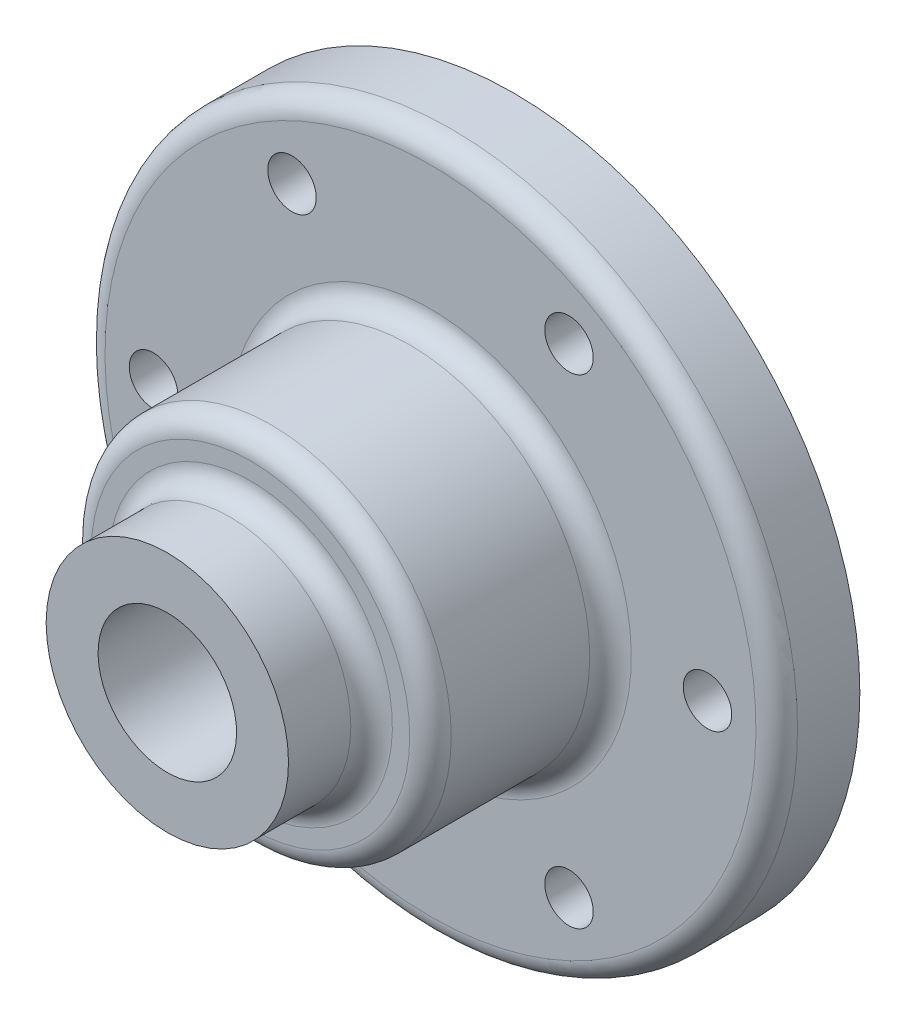
ISO-10303-21;
HEADER;
FILE_DESCRIPTION(('STEP AP214'),'2;1');
FILE_NAME('part.step','',(''),(''),'','','');
FILE_SCHEMA(('AUTOMOTIVE_DESIGN { 1 0 10303 214 1 1 1 1 }'));
ENDSEC;
DATA;
#1=APPLICATION_CONTEXT('core data for automotive mechanical design processes');
#2=APPLICATION_PROTOCOL_DEFINITION('international standard','automotive_design',2000,#1);
#3=PRODUCT_CONTEXT('',#1,'mechanical');
#4=PRODUCT('Part','Part','',(#3));
#5=PRODUCT_RELATED_PRODUCT_CATEGORY('part','',(#4));
#6=PRODUCT_DEFINITION_FORMATION('','',#4);
#7=PRODUCT_DEFINITION_CONTEXT('part definition',#1,'design');
#8=PRODUCT_DEFINITION('design','',#6,#7);
#9=PRODUCT_DEFINITION_SHAPE('','',#8);
#10=(LENGTH_UNIT() NAMED_UNIT(*) SI_UNIT(.MILLI.,.METRE.));
#11=(NAMED_UNIT(*) PLANE_ANGLE_UNIT() SI_UNIT($,.RADIAN.));
#12=(NAMED_UNIT(*) SI_UNIT($,.STERADIAN.) SOLID_ANGLE_UNIT());
#13=UNCERTAINTY_MEASURE_WITH_UNIT(LENGTH_MEASURE(1.E-05),#10,'distance_accuracy_value','');
#14=(GEOMETRIC_REPRESENTATION_CONTEXT(3) GLOBAL_UNCERTAINTY_ASSIGNED_CONTEXT((#13)) GLOBAL_UNIT_ASSIGNED_CONTEXT((#10,
#11,#12)) REPRESENTATION_CONTEXT('',''));
#15=CARTESIAN_POINT('',(0.,0.,0.));
#16=DIRECTION('',(0.,0.,1.));
#17=DIRECTION('',(1.,0.,0.));
#18=AXIS2_PLACEMENT_3D('',#15,#16,#17);
#19=CARTESIAN_POINT('',(0.,50.,0.));
#20=DIRECTION('',(0.,0.,-1.));
#21=DIRECTION('',(0.,1.,0.));
#22=AXIS2_PLACEMENT_3D('',#19,#20,#21);
#23=PLANE('',#22);
#24=CARTESIAN_POINT('',(0.,0.,0.));
#25=DIRECTION('',(0.,0.,-1.));
#26=DIRECTION('',(-1.,0.,0.));
#27=AXIS2_PLACEMENT_3D('',#24,#25,#26);
#28=CIRCLE('',#27,27.25);
#29=CARTESIAN_POINT('',(-27.25,0.,0.));
#30=VERTEX_POINT('',#29);
#31=EDGE_CURVE('E129',#30,#30,#28,.T.);
#32=ORIENTED_EDGE('',*,*,#31,.T.);
#33=EDGE_LOOP('',(#32));
#34=FACE_BOUND('',#33,.T.);
#35=CARTESIAN_POINT('',(0.,0.,0.));
#36=DIRECTION('',(0.,0.,-1.));
#37=DIRECTION('',(0.,1.,0.));
#38=AXIS2_PLACEMENT_3D('',#35,#36,#37);
#39=CIRCLE('',#38,20.);
#40=CARTESIAN_POINT('',(0.,20.,0.));
#41=VERTEX_POINT('',#40);
#42=EDGE_CURVE('E84',#41,#41,#39,.T.);
#43=ORIENTED_EDGE('',*,*,#42,.F.);
#44=EDGE_LOOP('',(#43));
#45=FACE_BOUND('',#44,.T.);
#46=ADVANCED_FACE('F40',(#34,#45),#23,.T.);
#47=CARTESIAN_POINT('',(0.,0.,0.));
#48=DIRECTION('',(0.,0.,-1.));
#49=DIRECTION('',(0.,1.,0.));
#50=AXIS2_PLACEMENT_3D('',#47,#48,#49);
#51=CYLINDRICAL_SURFACE('',#50,17.5);
#52=CARTESIAN_POINT('',(0.,0.,41.));
#53=DIRECTION('',(0.,0.,1.));
#54=DIRECTION('',(0.,-1.,0.));
#55=AXIS2_PLACEMENT_3D('',#52,#53,#54);
#56=CIRCLE('',#55,17.5);
#57=CARTESIAN_POINT('',(0.,-17.5,41.));
#58=VERTEX_POINT('',#57);
#59=EDGE_CURVE('E63',#58,#58,#56,.T.);
#60=ORIENTED_EDGE('',*,*,#59,.T.);
#61=EDGE_LOOP('',(#60));
#62=FACE_BOUND('',#61,.T.);
#63=CARTESIAN_POINT('',(0.,0.,50.));
#64=DIRECTION('',(0.,0.,-1.));
#65=DIRECTION('',(0.,1.,0.));
#66=AXIS2_PLACEMENT_3D('',#63,#64,#65);
#67=CIRCLE('',#66,17.5);
#68=CARTESIAN_POINT('',(0.,17.5,50.));
#69=VERTEX_POINT('',#68);
#70=EDGE_CURVE('E72',#69,#69,#67,.T.);
#71=ORIENTED_EDGE('',*,*,#70,.T.);
#72=EDGE_LOOP('',(#71));
#73=FACE_BOUND('',#72,.T.);
#74=ADVANCED_FACE('F160',(#62,#73),#51,.T.);
#75=CARTESIAN_POINT('',(0.,17.5,50.));
#76=DIRECTION('',(0.,0.,1.));
#77=DIRECTION('',(0.,-1.,0.));
#78=AXIS2_PLACEMENT_3D('',#75,#76,#77);
#79=PLANE('',#78);
#80=CARTESIAN_POINT('',(0.,0.,50.));
#81=DIRECTION('',(0.,0.,-1.));
#82=DIRECTION('',(0.,1.,0.));
#83=AXIS2_PLACEMENT_3D('',#80,#81,#82);
#84=CIRCLE('',#83,10.);
#85=CARTESIAN_POINT('',(0.,9.99999999999999,50.));
#86=VERTEX_POINT('',#85);
#87=EDGE_CURVE('E75',#86,#86,#84,.T.);
#88=ORIENTED_EDGE('',*,*,#87,.T.);
#89=EDGE_LOOP('',(#88));
#90=FACE_BOUND('',#89,.T.);
#91=ORIENTED_EDGE('',*,*,#70,.F.);
#92=EDGE_LOOP('',(#91));
#93=FACE_BOUND('',#92,.T.);
#94=ADVANCED_FACE('F167',(#90,#93),#79,.T.);
#95=CARTESIAN_POINT('',(0.,0.,0.));
#96=DIRECTION('',(0.,0.,-1.));
#97=DIRECTION('',(0.,1.,0.));
#98=AXIS2_PLACEMENT_3D('',#95,#96,#97);
#99=CYLINDRICAL_SURFACE('',#98,10.);
#100=CARTESIAN_POINT('',(0.,0.,9.99999999999999));
#101=DIRECTION('',(0.,0.,-1.));
#102=DIRECTION('',(0.,1.,0.));
#103=AXIS2_PLACEMENT_3D('',#100,#101,#102);
#104=CIRCLE('',#103,10.);
#105=CARTESIAN_POINT('',(0.,10.,9.99999999999999));
#106=VERTEX_POINT('',#105);
#107=EDGE_CURVE('E78',#106,#106,#104,.T.);
#108=ORIENTED_EDGE('',*,*,#107,.T.);
#109=EDGE_LOOP('',(#108));
#110=FACE_BOUND('',#109,.T.);
#111=ORIENTED_EDGE('',*,*,#87,.F.);
#112=EDGE_LOOP('',(#111));
#113=FACE_BOUND('',#112,.T.);
#114=ADVANCED_FACE('F285',(#110,#113),#99,.F.);
#115=CARTESIAN_POINT('',(0.,20.,9.99999999999999));
#116=DIRECTION('',(0.,0.,-1.));
#117=DIRECTION('',(0.,1.,0.));
#118=AXIS2_PLACEMENT_3D('',#115,#116,#117);
#119=PLANE('',#118);
#120=CARTESIAN_POINT('',(0.,0.,9.99999999999999));
#121=DIRECTION('',(0.,0.,-1.));
#122=DIRECTION('',(0.,1.,0.));
#123=AXIS2_PLACEMENT_3D('',#120,#121,#122);
#124=CIRCLE('',#123,20.);
#125=CARTESIAN_POINT('',(0.,20.,10.));
#126=VERTEX_POINT('',#125);
#127=EDGE_CURVE('E81',#126,#126,#124,.T.);
#128=ORIENTED_EDGE('',*,*,#127,.T.);
#129=EDGE_LOOP('',(#128));
#130=FACE_BOUND('',#129,.T.);
#131=ORIENTED_EDGE('',*,*,#107,.F.);
#132=EDGE_LOOP('',(#131));
#133=FACE_BOUND('',#132,.T.);
#134=ADVANCED_FACE('F182',(#130,#133),#119,.T.);
#135=CARTESIAN_POINT('',(0.,0.,0.));
#136=DIRECTION('',(0.,0.,-1.));
#137=DIRECTION('',(0.,1.,0.));
#138=AXIS2_PLACEMENT_3D('',#135,#136,#137);
#139=CYLINDRICAL_SURFACE('',#138,20.);
#140=ORIENTED_EDGE('',*,*,#42,.T.);
#141=EDGE_LOOP('',(#140));
#142=FACE_BOUND('',#141,.T.);
#143=ORIENTED_EDGE('',*,*,#127,.F.);
#144=EDGE_LOOP('',(#143));
#145=FACE_BOUND('',#144,.T.);
#146=ADVANCED_FACE('F175',(#142,#145),#139,.F.);
#147=CARTESIAN_POINT('',(0.,0.,0.));
#148=DIRECTION('',(0.,0.,-1.));
#149=DIRECTION('',(-1.,0.,0.));
#150=AXIS2_PLACEMENT_3D('',#147,#148,#149);
#151=CIRCLE('',#150,30.8);
#152=CARTESIAN_POINT('',(-30.8,0.,0.));
#153=VERTEX_POINT('',#152);
#154=EDGE_CURVE('E132',#153,#153,#151,.T.);
#155=ORIENTED_EDGE('',*,*,#154,.F.);
#156=EDGE_LOOP('',(#155));
#157=FACE_BOUND('',#156,.T.);
#158=CARTESIAN_POINT('',(20.0000000000004,34.6410161513773,0.));
#159=DIRECTION('',(0.,0.,1.));
#160=DIRECTION('',(0.50000000000001,0.866025403784433,0.));
#161=AXIS2_PLACEMENT_3D('',#158,#159,#160);
#162=CIRCLE('',#161,3.5);
#163=CARTESIAN_POINT('',(21.7500000000004,37.6721050646228,0.));
#164=VERTEX_POINT('',#163);
#165=EDGE_CURVE('E107',#164,#164,#162,.T.);
#166=ORIENTED_EDGE('',*,*,#165,.T.);
#167=EDGE_LOOP('',(#166));
#168=FACE_BOUND('',#167,.T.);
#169=CARTESIAN_POINT('',(-19.9999999999997,34.6410161513777,0.));
#170=DIRECTION('',(0.,0.,1.));
#171=DIRECTION('',(-0.499999999999992,0.866025403784443,0.));
#172=AXIS2_PLACEMENT_3D('',#169,#170,#171);
#173=CIRCLE('',#172,3.5);
#174=CARTESIAN_POINT('',(-21.7499999999996,37.6721050646233,0.));
#175=VERTEX_POINT('',#174);
#176=EDGE_CURVE('E106',#175,#175,#173,.T.);
#177=ORIENTED_EDGE('',*,*,#176,.T.);
#178=EDGE_LOOP('',(#177));
#179=FACE_BOUND('',#178,.T.);
#180=CARTESIAN_POINT('',(-40.,0.,0.));
#181=DIRECTION('',(0.,0.,1.));
#182=DIRECTION('',(-1.,0.,0.));
#183=AXIS2_PLACEMENT_3D('',#180,#181,#182);
#184=CIRCLE('',#183,3.5);
#185=CARTESIAN_POINT('',(-43.5,0.,0.));
#186=VERTEX_POINT('',#185);
#187=EDGE_CURVE('E114',#186,#186,#184,.T.);
#188=ORIENTED_EDGE('',*,*,#187,.T.);
#189=EDGE_LOOP('',(#188));
#190=FACE_BOUND('',#189,.T.);
#191=CARTESIAN_POINT('',(-20.0000000000002,-34.6410161513775,0.));
#192=DIRECTION('',(0.,0.,1.));
#193=DIRECTION('',(-0.500000000000004,-0.866025403784436,0.));
#194=AXIS2_PLACEMENT_3D('',#191,#192,#193);
#195=CIRCLE('',#194,3.5);
#196=CARTESIAN_POINT('',(-21.7500000000002,-37.672105064623,0.));
#197=VERTEX_POINT('',#196);
#198=EDGE_CURVE('E120',#197,#197,#195,.T.);
#199=ORIENTED_EDGE('',*,*,#198,.T.);
#200=EDGE_LOOP('',(#199));
#201=FACE_BOUND('',#200,.T.);
#202=CARTESIAN_POINT('',(19.9999999999999,-34.6410161513776,0.));
#203=DIRECTION('',(0.,0.,1.));
#204=DIRECTION('',(0.499999999999998,-0.86602540378444,0.));
#205=AXIS2_PLACEMENT_3D('',#202,#203,#204);
#206=CIRCLE('',#205,3.5);
#207=CARTESIAN_POINT('',(21.7499999999999,-37.6721050646231,0.));
#208=VERTEX_POINT('',#207);
#209=EDGE_CURVE('E99',#208,#208,#206,.T.);
#210=ORIENTED_EDGE('',*,*,#209,.T.);
#211=EDGE_LOOP('',(#210));
#212=FACE_BOUND('',#211,.T.);
#213=CARTESIAN_POINT('',(40.,0.,0.));
#214=DIRECTION('',(0.,0.,1.));
#215=DIRECTION('',(1.,0.,0.));
#216=AXIS2_PLACEMENT_3D('',#213,#214,#215);
#217=CIRCLE('',#216,3.5);
#218=CARTESIAN_POINT('',(43.5,0.,0.));
#219=VERTEX_POINT('',#218);
#220=EDGE_CURVE('E90',#219,#219,#217,.T.);
#221=ORIENTED_EDGE('',*,*,#220,.T.);
#222=EDGE_LOOP('',(#221));
#223=FACE_BOUND('',#222,.T.);
#224=CARTESIAN_POINT('',(0.,0.,0.));
#225=DIRECTION('',(0.,0.,-1.));
#226=DIRECTION('',(0.,1.,0.));
#227=AXIS2_PLACEMENT_3D('',#224,#225,#226);
#228=CIRCLE('',#227,50.);
#229=CARTESIAN_POINT('',(0.,50.,0.));
#230=VERTEX_POINT('',#229);
#231=EDGE_CURVE('E87',#230,#230,#228,.T.);
#232=ORIENTED_EDGE('',*,*,#231,.T.);
#233=EDGE_LOOP('',(#232));
#234=FACE_BOUND('',#233,.T.);
#235=ADVANCED_FACE('F163',(#157,#168,#179,#190,#201,#212,#223,#234),#23,.T.);
#236=CARTESIAN_POINT('',(0.,0.,0.));
#237=DIRECTION('',(0.,0.,-1.));
#238=DIRECTION('',(0.,1.,0.));
#239=AXIS2_PLACEMENT_3D('',#236,#237,#238);
#240=CYLINDRICAL_SURFACE('',#239,50.);
#241=CARTESIAN_POINT('',(0.,0.,8.99999999999999));
#242=DIRECTION('',(0.,0.,1.));
#243=DIRECTION('',(0.,-1.,0.));
#244=AXIS2_PLACEMENT_3D('',#241,#242,#243);
#245=CIRCLE('',#244,50.);
#246=CARTESIAN_POINT('',(0.,-50.,8.99999999999998));
#247=VERTEX_POINT('',#246);
#248=EDGE_CURVE('E10',#247,#247,#245,.F.);
#249=ORIENTED_EDGE('',*,*,#248,.T.);
#250=EDGE_LOOP('',(#249));
#251=FACE_BOUND('',#250,.T.);
#252=ORIENTED_EDGE('',*,*,#231,.F.);
#253=EDGE_LOOP('',(#252));
#254=FACE_BOUND('',#253,.T.);
#255=ADVANCED_FACE('F174',(#251,#254),#240,.T.);
#256=CARTESIAN_POINT('',(0.,26.,12.));
#257=DIRECTION('',(0.,0.,1.));
#258=DIRECTION('',(0.,-1.,0.));
#259=AXIS2_PLACEMENT_3D('',#256,#257,#258);
#260=PLANE('',#259);
#261=CARTESIAN_POINT('',(0.,0.,12.));
#262=DIRECTION('',(0.,0.,1.));
#263=DIRECTION('',(0.,-1.,0.));
#264=AXIS2_PLACEMENT_3D('',#261,#262,#263);
#265=CIRCLE('',#264,29.);
#266=CARTESIAN_POINT('',(0.,-29.,12.));
#267=VERTEX_POINT('',#266);
#268=EDGE_CURVE('E47',#267,#267,#265,.F.);
#269=ORIENTED_EDGE('',*,*,#268,.T.);
#270=EDGE_LOOP('',(#269));
#271=FACE_BOUND('',#270,.T.);
#272=CARTESIAN_POINT('',(0.,0.,12.));
#273=DIRECTION('',(0.,0.,1.));
#274=DIRECTION('',(0.,-1.,0.));
#275=AXIS2_PLACEMENT_3D('',#272,#273,#274);
#276=CIRCLE('',#275,47.);
#277=CARTESIAN_POINT('',(0.,-47.,12.));
#278=VERTEX_POINT('',#277);
#279=EDGE_CURVE('E51',#278,#278,#276,.T.);
#280=ORIENTED_EDGE('',*,*,#279,.T.);
#281=EDGE_LOOP('',(#280));
#282=FACE_BOUND('',#281,.T.);
#283=CARTESIAN_POINT('',(20.0000000000004,34.6410161513773,12.));
#284=DIRECTION('',(0.,0.,1.));
#285=DIRECTION('',(0.50000000000001,0.866025403784433,0.));
#286=AXIS2_PLACEMENT_3D('',#283,#284,#285);
#287=CIRCLE('',#286,3.5);
#288=CARTESIAN_POINT('',(21.7500000000004,37.6721050646228,12.));
#289=VERTEX_POINT('',#288);
#290=EDGE_CURVE('E103',#289,#289,#287,.T.);
#291=ORIENTED_EDGE('',*,*,#290,.F.);
#292=EDGE_LOOP('',(#291));
#293=FACE_BOUND('',#292,.T.);
#294=CARTESIAN_POINT('',(-19.9999999999997,34.6410161513777,12.));
#295=DIRECTION('',(0.,0.,1.));
#296=DIRECTION('',(-0.499999999999992,0.866025403784443,0.));
#297=AXIS2_PLACEMENT_3D('',#294,#295,#296);
#298=CIRCLE('',#297,3.5);
#299=CARTESIAN_POINT('',(-21.7499999999996,37.6721050646233,12.));
#300=VERTEX_POINT('',#299);
#301=EDGE_CURVE('E111',#300,#300,#298,.T.);
#302=ORIENTED_EDGE('',*,*,#301,.F.);
#303=EDGE_LOOP('',(#302));
#304=FACE_BOUND('',#303,.T.);
#305=CARTESIAN_POINT('',(-40.,0.,12.));
#306=DIRECTION('',(0.,0.,1.));
#307=DIRECTION('',(-1.,0.,0.));
#308=AXIS2_PLACEMENT_3D('',#305,#306,#307);
#309=CIRCLE('',#308,3.5);
#310=CARTESIAN_POINT('',(-43.5,0.,12.));
#311=VERTEX_POINT('',#310);
#312=EDGE_CURVE('E117',#311,#311,#309,.T.);
#313=ORIENTED_EDGE('',*,*,#312,.F.);
#314=EDGE_LOOP('',(#313));
#315=FACE_BOUND('',#314,.T.);
#316=CARTESIAN_POINT('',(-20.0000000000002,-34.6410161513775,12.));
#317=DIRECTION('',(0.,0.,1.));
#318=DIRECTION('',(-0.500000000000004,-0.866025403784436,0.));
#319=AXIS2_PLACEMENT_3D('',#316,#317,#318);
#320=CIRCLE('',#319,3.5);
#321=CARTESIAN_POINT('',(-21.7500000000002,-37.672105064623,12.));
#322=VERTEX_POINT('',#321);
#323=EDGE_CURVE('E102',#322,#322,#320,.T.);
#324=ORIENTED_EDGE('',*,*,#323,.F.);
#325=EDGE_LOOP('',(#324));
#326=FACE_BOUND('',#325,.T.);
#327=CARTESIAN_POINT('',(19.9999999999999,-34.6410161513776,12.));
#328=DIRECTION('',(0.,0.,1.));
#329=DIRECTION('',(0.499999999999998,-0.86602540378444,0.));
#330=AXIS2_PLACEMENT_3D('',#327,#328,#329);
#331=CIRCLE('',#330,3.5);
#332=CARTESIAN_POINT('',(21.7499999999999,-37.6721050646231,12.));
#333=VERTEX_POINT('',#332);
#334=EDGE_CURVE('E96',#333,#333,#331,.T.);
#335=ORIENTED_EDGE('',*,*,#334,.F.);
#336=EDGE_LOOP('',(#335));
#337=FACE_BOUND('',#336,.T.);
#338=CARTESIAN_POINT('',(40.,0.,12.));
#339=DIRECTION('',(0.,0.,1.));
#340=DIRECTION('',(1.,0.,0.));
#341=AXIS2_PLACEMENT_3D('',#338,#339,#340);
#342=CIRCLE('',#341,3.5);
#343=CARTESIAN_POINT('',(43.5,0.,12.));
#344=VERTEX_POINT('',#343);
#345=EDGE_CURVE('E93',#344,#344,#342,.T.);
#346=ORIENTED_EDGE('',*,*,#345,.F.);
#347=EDGE_LOOP('',(#346));
#348=FACE_BOUND('',#347,.T.);
#349=ADVANCED_FACE('F181',(#271,#282,#293,#304,#315,#326,#337,#348),#260,.T.);
#350=CARTESIAN_POINT('',(0.,0.,0.));
#351=DIRECTION('',(0.,0.,-1.));
#352=DIRECTION('',(0.,1.,0.));
#353=AXIS2_PLACEMENT_3D('',#350,#351,#352);
#354=CYLINDRICAL_SURFACE('',#353,26.);
#355=CARTESIAN_POINT('',(0.,0.,35.));
#356=DIRECTION('',(0.,0.,1.));
#357=DIRECTION('',(0.,-1.,0.));
#358=AXIS2_PLACEMENT_3D('',#355,#356,#357);
#359=CIRCLE('',#358,26.);
#360=CARTESIAN_POINT('',(0.,-26.,35.));
#361=VERTEX_POINT('',#360);
#362=EDGE_CURVE('E55',#361,#361,#359,.F.);
#363=ORIENTED_EDGE('',*,*,#362,.T.);
#364=EDGE_LOOP('',(#363));
#365=FACE_BOUND('',#364,.T.);
#366=CARTESIAN_POINT('',(0.,0.,15.));
#367=DIRECTION('',(0.,0.,1.));
#368=DIRECTION('',(0.,-1.,0.));
#369=AXIS2_PLACEMENT_3D('',#366,#367,#368);
#370=CIRCLE('',#369,26.);
#371=CARTESIAN_POINT('',(0.,-26.,15.));
#372=VERTEX_POINT('',#371);
#373=EDGE_CURVE('E60',#372,#372,#370,.T.);
#374=ORIENTED_EDGE('',*,*,#373,.T.);
#375=EDGE_LOOP('',(#374));
#376=FACE_BOUND('',#375,.T.);
#377=ADVANCED_FACE('F210',(#365,#376),#354,.T.);
#378=CARTESIAN_POINT('',(0.,17.5,38.));
#379=DIRECTION('',(0.,0.,1.));
#380=DIRECTION('',(0.,-1.,0.));
#381=AXIS2_PLACEMENT_3D('',#378,#379,#380);
#382=PLANE('',#381);
#383=CARTESIAN_POINT('',(0.,0.,38.));
#384=DIRECTION('',(0.,0.,1.));
#385=DIRECTION('',(0.,-1.,0.));
#386=AXIS2_PLACEMENT_3D('',#383,#384,#385);
#387=CIRCLE('',#386,20.5);
#388=CARTESIAN_POINT('',(0.,-20.5,38.));
#389=VERTEX_POINT('',#388);
#390=EDGE_CURVE('E66',#389,#389,#387,.F.);
#391=ORIENTED_EDGE('',*,*,#390,.T.);
#392=EDGE_LOOP('',(#391));
#393=FACE_BOUND('',#392,.T.);
#394=CARTESIAN_POINT('',(0.,0.,38.));
#395=DIRECTION('',(0.,0.,1.));
#396=DIRECTION('',(0.,-1.,0.));
#397=AXIS2_PLACEMENT_3D('',#394,#395,#396);
#398=CIRCLE('',#397,23.);
#399=CARTESIAN_POINT('',(0.,-23.,38.));
#400=VERTEX_POINT('',#399);
#401=EDGE_CURVE('E69',#400,#400,#398,.T.);
#402=ORIENTED_EDGE('',*,*,#401,.T.);
#403=EDGE_LOOP('',(#402));
#404=FACE_BOUND('',#403,.T.);
#405=ADVANCED_FACE('F205',(#393,#404),#382,.T.);
#406=CARTESIAN_POINT('',(40.,0.,12.));
#407=DIRECTION('',(0.,0.,1.));
#408=DIRECTION('',(1.,0.,0.));
#409=AXIS2_PLACEMENT_3D('',#406,#407,#408);
#410=CYLINDRICAL_SURFACE('',#409,3.5);
#411=ORIENTED_EDGE('',*,*,#220,.F.);
#412=EDGE_LOOP('',(#411));
#413=FACE_BOUND('',#412,.T.);
#414=ORIENTED_EDGE('',*,*,#345,.T.);
#415=EDGE_LOOP('',(#414));
#416=FACE_BOUND('',#415,.T.);
#417=ADVANCED_FACE('F201',(#413,#416),#410,.F.);
#418=CARTESIAN_POINT('',(19.9999999999999,-34.6410161513776,12.));
#419=DIRECTION('',(0.,0.,1.));
#420=DIRECTION('',(0.499999999999998,-0.86602540378444,0.));
#421=AXIS2_PLACEMENT_3D('',#418,#419,#420);
#422=CYLINDRICAL_SURFACE('',#421,3.5);
#423=ORIENTED_EDGE('',*,*,#209,.F.);
#424=EDGE_LOOP('',(#423));
#425=FACE_BOUND('',#424,.T.);
#426=ORIENTED_EDGE('',*,*,#334,.T.);
#427=EDGE_LOOP('',(#426));
#428=FACE_BOUND('',#427,.T.);
#429=ADVANCED_FACE('F204',(#425,#428),#422,.F.);
#430=CARTESIAN_POINT('',(-20.0000000000002,-34.6410161513775,12.));
#431=DIRECTION('',(0.,0.,1.));
#432=DIRECTION('',(-0.500000000000004,-0.866025403784436,0.));
#433=AXIS2_PLACEMENT_3D('',#430,#431,#432);
#434=CYLINDRICAL_SURFACE('',#433,3.5);
#435=ORIENTED_EDGE('',*,*,#198,.F.);
#436=EDGE_LOOP('',(#435));
#437=FACE_BOUND('',#436,.T.);
#438=ORIENTED_EDGE('',*,*,#323,.T.);
#439=EDGE_LOOP('',(#438));
#440=FACE_BOUND('',#439,.T.);
#441=ADVANCED_FACE('F224',(#437,#440),#434,.F.);
#442=CARTESIAN_POINT('',(-40.,0.,12.));
#443=DIRECTION('',(0.,0.,1.));
#444=DIRECTION('',(-1.,0.,0.));
#445=AXIS2_PLACEMENT_3D('',#442,#443,#444);
#446=CYLINDRICAL_SURFACE('',#445,3.5);
#447=ORIENTED_EDGE('',*,*,#187,.F.);
#448=EDGE_LOOP('',(#447));
#449=FACE_BOUND('',#448,.T.);
#450=ORIENTED_EDGE('',*,*,#312,.T.);
#451=EDGE_LOOP('',(#450));
#452=FACE_BOUND('',#451,.T.);
#453=ADVANCED_FACE('F234',(#449,#452),#446,.F.);
#454=CARTESIAN_POINT('',(-19.9999999999997,34.6410161513777,12.));
#455=DIRECTION('',(0.,0.,1.));
#456=DIRECTION('',(-0.499999999999992,0.866025403784443,0.));
#457=AXIS2_PLACEMENT_3D('',#454,#455,#456);
#458=CYLINDRICAL_SURFACE('',#457,3.5);
#459=ORIENTED_EDGE('',*,*,#176,.F.);
#460=EDGE_LOOP('',(#459));
#461=FACE_BOUND('',#460,.T.);
#462=ORIENTED_EDGE('',*,*,#301,.T.);
#463=EDGE_LOOP('',(#462));
#464=FACE_BOUND('',#463,.T.);
#465=ADVANCED_FACE('F230',(#461,#464),#458,.F.);
#466=CARTESIAN_POINT('',(20.0000000000004,34.6410161513773,12.));
#467=DIRECTION('',(0.,0.,1.));
#468=DIRECTION('',(0.50000000000001,0.866025403784433,0.));
#469=AXIS2_PLACEMENT_3D('',#466,#467,#468);
#470=CYLINDRICAL_SURFACE('',#469,3.5);
#471=ORIENTED_EDGE('',*,*,#165,.F.);
#472=EDGE_LOOP('',(#471));
#473=FACE_BOUND('',#472,.T.);
#474=ORIENTED_EDGE('',*,*,#290,.T.);
#475=EDGE_LOOP('',(#474));
#476=FACE_BOUND('',#475,.T.);
#477=ADVANCED_FACE('F226',(#473,#476),#470,.F.);
#478=CARTESIAN_POINT('',(0.,0.,41.));
#479=DIRECTION('',(0.,0.,1.));
#480=DIRECTION('',(0.,-1.,0.));
#481=AXIS2_PLACEMENT_3D('',#478,#479,#480);
#482=TOROIDAL_SURFACE('',#481,20.5,3.);
#483=ORIENTED_EDGE('',*,*,#59,.F.);
#484=EDGE_LOOP('',(#483));
#485=FACE_BOUND('',#484,.T.);
#486=ORIENTED_EDGE('',*,*,#390,.F.);
#487=EDGE_LOOP('',(#486));
#488=FACE_BOUND('',#487,.T.);
#489=ADVANCED_FACE('F229',(#485,#488),#482,.F.);
#490=CARTESIAN_POINT('',(0.,0.,35.));
#491=DIRECTION('',(0.,0.,1.));
#492=DIRECTION('',(0.,-1.,0.));
#493=AXIS2_PLACEMENT_3D('',#490,#491,#492);
#494=TOROIDAL_SURFACE('',#493,23.,3.);
#495=ORIENTED_EDGE('',*,*,#401,.F.);
#496=EDGE_LOOP('',(#495));
#497=FACE_BOUND('',#496,.T.);
#498=ORIENTED_EDGE('',*,*,#362,.F.);
#499=EDGE_LOOP('',(#498));
#500=FACE_BOUND('',#499,.T.);
#501=ADVANCED_FACE('F355',(#497,#500),#494,.T.);
#502=CARTESIAN_POINT('',(0.,0.,15.));
#503=DIRECTION('',(0.,0.,1.));
#504=DIRECTION('',(0.,-1.,0.));
#505=AXIS2_PLACEMENT_3D('',#502,#503,#504);
#506=TOROIDAL_SURFACE('',#505,29.,3.);
#507=ORIENTED_EDGE('',*,*,#373,.F.);
#508=EDGE_LOOP('',(#507));
#509=FACE_BOUND('',#508,.T.);
#510=ORIENTED_EDGE('',*,*,#268,.F.);
#511=EDGE_LOOP('',(#510));
#512=FACE_BOUND('',#511,.T.);
#513=ADVANCED_FACE('F348',(#509,#512),#506,.F.);
#514=CARTESIAN_POINT('',(0.,0.,8.99999999999999));
#515=DIRECTION('',(0.,0.,1.));
#516=DIRECTION('',(0.,-1.,0.));
#517=AXIS2_PLACEMENT_3D('',#514,#515,#516);
#518=TOROIDAL_SURFACE('',#517,47.,3.);
#519=ORIENTED_EDGE('',*,*,#279,.F.);
#520=EDGE_LOOP('',(#519));
#521=FACE_BOUND('',#520,.T.);
#522=ORIENTED_EDGE('',*,*,#248,.F.);
#523=EDGE_LOOP('',(#522));
#524=FACE_BOUND('',#523,.T.);
#525=ADVANCED_FACE('F42',(#521,#524),#518,.T.);
#526=CARTESIAN_POINT('',(0.,0.,2.075));
#527=DIRECTION('',(0.,0.,-1.));
#528=DIRECTION('',(-1.,0.,0.));
#529=AXIS2_PLACEMENT_3D('',#526,#527,#528);
#530=TOROIDAL_SURFACE('',#529,27.85,0.6);
#531=CARTESIAN_POINT('',(0.,0.,2.675));
#532=DIRECTION('',(0.,0.,-1.));
#533=DIRECTION('',(-1.,0.,0.));
#534=AXIS2_PLACEMENT_3D('',#531,#532,#533);
#535=CIRCLE('',#534,27.85);
#536=CARTESIAN_POINT('',(-27.85,0.,2.675));
#537=VERTEX_POINT('',#536);
#538=EDGE_CURVE('E141',#537,#537,#535,.T.);
#539=ORIENTED_EDGE('',*,*,#538,.T.);
#540=EDGE_LOOP('',(#539));
#541=FACE_BOUND('',#540,.T.);
#542=CARTESIAN_POINT('',(0.,0.,2.075));
#543=DIRECTION('',(0.,0.,-1.));
#544=DIRECTION('',(-1.,0.,0.));
#545=AXIS2_PLACEMENT_3D('',#542,#543,#544);
#546=CIRCLE('',#545,27.25);
#547=CARTESIAN_POINT('',(-27.25,0.,2.075));
#548=VERTEX_POINT('',#547);
#549=EDGE_CURVE('E110',#548,#548,#546,.T.);
#550=ORIENTED_EDGE('',*,*,#549,.F.);
#551=EDGE_LOOP('',(#550));
#552=FACE_BOUND('',#551,.T.);
#553=ADVANCED_FACE('F145',(#541,#552),#530,.F.);
#554=CARTESIAN_POINT('',(0.,0.,-50.));
#555=DIRECTION('',(0.,0.,-1.));
#556=DIRECTION('',(-1.,0.,0.));
#557=AXIS2_PLACEMENT_3D('',#554,#555,#556);
#558=CYLINDRICAL_SURFACE('',#557,27.25);
#559=ORIENTED_EDGE('',*,*,#549,.T.);
#560=EDGE_LOOP('',(#559));
#561=FACE_BOUND('',#560,.T.);
#562=ORIENTED_EDGE('',*,*,#31,.F.);
#563=EDGE_LOOP('',(#562));
#564=FACE_BOUND('',#563,.T.);
#565=ADVANCED_FACE('F244',(#561,#564),#558,.T.);
#566=CARTESIAN_POINT('',(0.,0.,-50.));
#567=DIRECTION('',(0.,0.,-1.));
#568=DIRECTION('',(-1.,0.,0.));
#569=AXIS2_PLACEMENT_3D('',#566,#567,#568);
#570=CYLINDRICAL_SURFACE('',#569,30.8);
#571=ORIENTED_EDGE('',*,*,#154,.T.);
#572=EDGE_LOOP('',(#571));
#573=FACE_BOUND('',#572,.T.);
#574=CARTESIAN_POINT('',(0.,0.,2.075));
#575=DIRECTION('',(0.,0.,-1.));
#576=DIRECTION('',(-1.,0.,0.));
#577=AXIS2_PLACEMENT_3D('',#574,#575,#576);
#578=CIRCLE('',#577,30.8);
#579=CARTESIAN_POINT('',(-30.8,0.,2.075));
#580=VERTEX_POINT('',#579);
#581=EDGE_CURVE('E135',#580,#580,#578,.T.);
#582=ORIENTED_EDGE('',*,*,#581,.F.);
#583=EDGE_LOOP('',(#582));
#584=FACE_BOUND('',#583,.T.);
#585=ADVANCED_FACE('F156',(#573,#584),#570,.F.);
#586=CARTESIAN_POINT('',(0.,0.,2.075));
#587=DIRECTION('',(0.,0.,-1.));
#588=DIRECTION('',(-1.,0.,0.));
#589=AXIS2_PLACEMENT_3D('',#586,#587,#588);
#590=TOROIDAL_SURFACE('',#589,30.2,0.6);
#591=ORIENTED_EDGE('',*,*,#581,.T.);
#592=EDGE_LOOP('',(#591));
#593=FACE_BOUND('',#592,.T.);
#594=CARTESIAN_POINT('',(0.,0.,2.675));
#595=DIRECTION('',(0.,0.,-1.));
#596=DIRECTION('',(-1.,0.,0.));
#597=AXIS2_PLACEMENT_3D('',#594,#595,#596);
#598=CIRCLE('',#597,30.2);
#599=CARTESIAN_POINT('',(-30.2,0.,2.675));
#600=VERTEX_POINT('',#599);
#601=EDGE_CURVE('E138',#600,#600,#598,.T.);
#602=ORIENTED_EDGE('',*,*,#601,.F.);
#603=EDGE_LOOP('',(#602));
#604=FACE_BOUND('',#603,.T.);
#605=ADVANCED_FACE('F150',(#593,#604),#590,.F.);
#606=CARTESIAN_POINT('',(30.2,0.,2.675));
#607=DIRECTION('',(0.,0.,-1.));
#608=DIRECTION('',(-1.,0.,0.));
#609=AXIS2_PLACEMENT_3D('',#606,#607,#608);
#610=PLANE('',#609);
#611=ORIENTED_EDGE('',*,*,#601,.T.);
#612=EDGE_LOOP('',(#611));
#613=FACE_BOUND('',#612,.T.);
#614=ORIENTED_EDGE('',*,*,#538,.F.);
#615=EDGE_LOOP('',(#614));
#616=FACE_BOUND('',#615,.T.);
#617=ADVANCED_FACE('F148',(#613,#616),#610,.T.);
#618=CLOSED_SHELL('',(#46,#74,#94,#114,#134,#146,#235,#255,#349,#377,#405,#417,#429,#441,#453,
#465,#477,#489,#501,#513,#525,#553,#565,#585,#605,#617));
#619=MANIFOLD_SOLID_BREP('B2',#618);
#620=ADVANCED_BREP_SHAPE_REPRESENTATION('',(#18,#619),#14);
#621=SHAPE_DEFINITION_REPRESENTATION(#9,#620);
ENDSEC;
END-ISO-10303-21;
